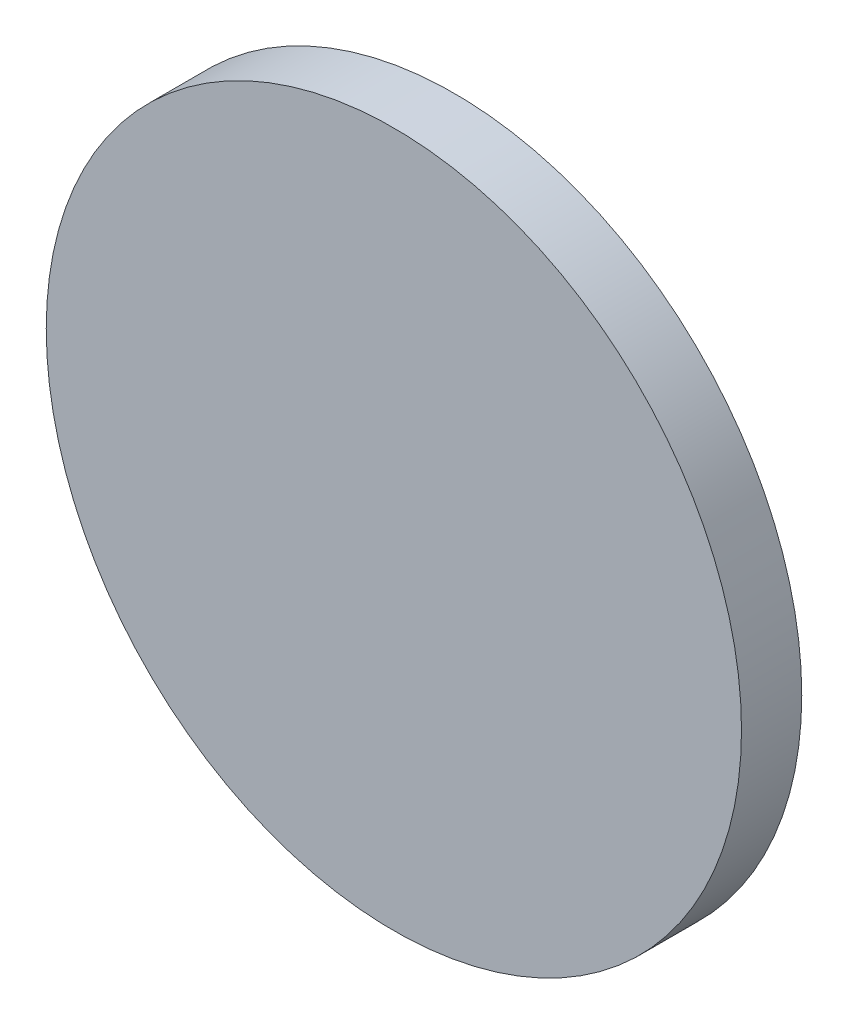
ISO-10303-21;
HEADER;
FILE_DESCRIPTION(('STEP AP214'),'2;1');
FILE_NAME('part.step','',(''),(''),'','','');
FILE_SCHEMA(('AUTOMOTIVE_DESIGN { 1 0 10303 214 1 1 1 1 }'));
ENDSEC;
DATA;
#1=APPLICATION_CONTEXT('core data for automotive mechanical design processes');
#2=APPLICATION_PROTOCOL_DEFINITION('international standard','automotive_design',2000,#1);
#3=PRODUCT_CONTEXT('',#1,'mechanical');
#4=PRODUCT('Part','Part','',(#3));
#5=PRODUCT_RELATED_PRODUCT_CATEGORY('part','',(#4));
#6=PRODUCT_DEFINITION_FORMATION('','',#4);
#7=PRODUCT_DEFINITION_CONTEXT('part definition',#1,'design');
#8=PRODUCT_DEFINITION('design','',#6,#7);
#9=PRODUCT_DEFINITION_SHAPE('','',#8);
#10=(LENGTH_UNIT() NAMED_UNIT(*) SI_UNIT(.MILLI.,.METRE.));
#11=(NAMED_UNIT(*) PLANE_ANGLE_UNIT() SI_UNIT($,.RADIAN.));
#12=(NAMED_UNIT(*) SI_UNIT($,.STERADIAN.) SOLID_ANGLE_UNIT());
#13=UNCERTAINTY_MEASURE_WITH_UNIT(LENGTH_MEASURE(1.E-05),#10,'distance_accuracy_value','');
#14=(GEOMETRIC_REPRESENTATION_CONTEXT(3) GLOBAL_UNCERTAINTY_ASSIGNED_CONTEXT((#13)) GLOBAL_UNIT_ASSIGNED_CONTEXT((#10,
#11,#12)) REPRESENTATION_CONTEXT('',''));
#15=CARTESIAN_POINT('',(0.,0.,0.));
#16=DIRECTION('',(0.,0.,1.));
#17=DIRECTION('',(1.,0.,0.));
#18=AXIS2_PLACEMENT_3D('',#15,#16,#17);
#19=CARTESIAN_POINT('',(0.,0.,6.5));
#20=DIRECTION('',(0.,0.,-1.));
#21=DIRECTION('',(-1.,0.,0.));
#22=AXIS2_PLACEMENT_3D('',#19,#20,#21);
#23=CYLINDRICAL_SURFACE('',#22,37.5);
#24=CARTESIAN_POINT('',(0.,0.,6.5));
#25=DIRECTION('',(0.,0.,1.));
#26=DIRECTION('',(1.,0.,0.));
#27=AXIS2_PLACEMENT_3D('',#24,#25,#26);
#28=CIRCLE('',#27,37.5);
#29=CARTESIAN_POINT('',(-37.5,0.,6.5));
#30=VERTEX_POINT('',#29);
#31=EDGE_CURVE('E10',#30,#30,#28,.T.);
#32=CARTESIAN_POINT('',(0.,0.,0.));
#33=DIRECTION('',(0.,0.,1.));
#34=DIRECTION('',(1.,0.,0.));
#35=AXIS2_PLACEMENT_3D('',#32,#33,#34);
#36=CIRCLE('',#35,37.5);
#37=CARTESIAN_POINT('',(-37.5,0.,0.));
#38=VERTEX_POINT('',#37);
#39=EDGE_CURVE('E37',#38,#38,#36,.T.);
#40=CARTESIAN_POINT('',(-37.5,0.,6.5));
#41=CARTESIAN_POINT('',(-37.5,0.,6.43229166666667));
#42=CARTESIAN_POINT('',(-37.5,0.,6.36458333333333));
#43=CARTESIAN_POINT('',(-37.5,0.,6.22916666666667));
#44=CARTESIAN_POINT('',(-37.5,0.,6.16145833333333));
#45=CARTESIAN_POINT('',(-37.5,0.,6.02604166666667));
#46=CARTESIAN_POINT('',(-37.5,0.,5.95833333333333));
#47=CARTESIAN_POINT('',(-37.5,0.,5.82291666666667));
#48=CARTESIAN_POINT('',(-37.5,0.,5.75520833333333));
#49=CARTESIAN_POINT('',(-37.5,0.,5.61979166666667));
#50=CARTESIAN_POINT('',(-37.5,0.,5.55208333333333));
#51=CARTESIAN_POINT('',(-37.5,0.,5.41666666666667));
#52=CARTESIAN_POINT('',(-37.5,0.,5.34895833333333));
#53=CARTESIAN_POINT('',(-37.5,0.,5.21354166666667));
#54=CARTESIAN_POINT('',(-37.5,0.,5.14583333333333));
#55=CARTESIAN_POINT('',(-37.5,0.,5.01041666666667));
#56=CARTESIAN_POINT('',(-37.5,0.,4.94270833333333));
#57=CARTESIAN_POINT('',(-37.5,0.,4.80729166666667));
#58=CARTESIAN_POINT('',(-37.5,0.,4.73958333333333));
#59=CARTESIAN_POINT('',(-37.5,0.,4.60416666666667));
#60=CARTESIAN_POINT('',(-37.5,0.,4.53645833333333));
#61=CARTESIAN_POINT('',(-37.5,0.,4.40104166666667));
#62=CARTESIAN_POINT('',(-37.5,0.,4.33333333333333));
#63=CARTESIAN_POINT('',(-37.5,0.,4.19791666666667));
#64=CARTESIAN_POINT('',(-37.5,0.,4.13020833333333));
#65=CARTESIAN_POINT('',(-37.5,0.,3.99479166666667));
#66=CARTESIAN_POINT('',(-37.5,0.,3.92708333333333));
#67=CARTESIAN_POINT('',(-37.5,0.,3.79166666666667));
#68=CARTESIAN_POINT('',(-37.5,0.,3.72395833333333));
#69=CARTESIAN_POINT('',(-37.5,0.,3.58854166666667));
#70=CARTESIAN_POINT('',(-37.5,0.,3.52083333333333));
#71=CARTESIAN_POINT('',(-37.5,0.,3.38541666666667));
#72=CARTESIAN_POINT('',(-37.5,0.,3.31770833333333));
#73=CARTESIAN_POINT('',(-37.5,0.,3.18229166666667));
#74=CARTESIAN_POINT('',(-37.5,0.,3.11458333333333));
#75=CARTESIAN_POINT('',(-37.5,0.,2.97916666666667));
#76=CARTESIAN_POINT('',(-37.5,0.,2.91145833333333));
#77=CARTESIAN_POINT('',(-37.5,0.,2.77604166666667));
#78=CARTESIAN_POINT('',(-37.5,0.,2.70833333333333));
#79=CARTESIAN_POINT('',(-37.5,0.,2.57291666666667));
#80=CARTESIAN_POINT('',(-37.5,0.,2.50520833333333));
#81=CARTESIAN_POINT('',(-37.5,0.,2.36979166666667));
#82=CARTESIAN_POINT('',(-37.5,0.,2.30208333333333));
#83=CARTESIAN_POINT('',(-37.5,0.,2.16666666666667));
#84=CARTESIAN_POINT('',(-37.5,0.,2.09895833333333));
#85=CARTESIAN_POINT('',(-37.5,0.,1.96354166666667));
#86=CARTESIAN_POINT('',(-37.5,0.,1.89583333333333));
#87=CARTESIAN_POINT('',(-37.5,0.,1.76041666666667));
#88=CARTESIAN_POINT('',(-37.5,0.,1.69270833333333));
#89=CARTESIAN_POINT('',(-37.5,0.,1.55729166666667));
#90=CARTESIAN_POINT('',(-37.5,0.,1.48958333333333));
#91=CARTESIAN_POINT('',(-37.5,0.,1.35416666666667));
#92=CARTESIAN_POINT('',(-37.5,0.,1.28645833333333));
#93=CARTESIAN_POINT('',(-37.5,0.,1.15104166666667));
#94=CARTESIAN_POINT('',(-37.5,0.,1.08333333333333));
#95=CARTESIAN_POINT('',(-37.5,0.,0.947916666666667));
#96=CARTESIAN_POINT('',(-37.5,0.,0.880208333333333));
#97=CARTESIAN_POINT('',(-37.5,0.,0.744791666666667));
#98=CARTESIAN_POINT('',(-37.5,0.,0.677083333333333));
#99=CARTESIAN_POINT('',(-37.5,0.,0.541666666666667));
#100=CARTESIAN_POINT('',(-37.5,0.,0.473958333333333));
#101=CARTESIAN_POINT('',(-37.5,0.,0.338541666666667));
#102=CARTESIAN_POINT('',(-37.5,0.,0.270833333333334));
#103=CARTESIAN_POINT('',(-37.5,0.,0.135416666666667));
#104=CARTESIAN_POINT('',(-37.5,0.,0.0677083333333334));
#105=CARTESIAN_POINT('',(-37.5,0.,0.));
#106=B_SPLINE_CURVE_WITH_KNOTS('',3,(#40,#41,#42,#43,#44,#45,#46,#47,#48,#49,#50,#51,#52,#53,
#54,#55,#56,#57,#58,#59,#60,#61,#62,#63,#64,#65,#66,#67,#68,#69,#70,#71,#72,#73,#74,#75,#76,#77,
#78,#79,#80,#81,#82,#83,#84,#85,#86,#87,#88,#89,#90,#91,#92,#93,#94,#95,#96,#97,#98,#99,#100,
#101,#102,#103,#104,#105),.UNSPECIFIED.,.F.,.F.,(4,2,2,2,2,2,2,2,2,2,2,2,2,2,2,2,2,2,2,2,2,2,2,
2,2,2,2,2,2,2,2,2,4),(0.,0.203125,0.40625,0.609375000000001,0.812500000000001,1.015625,1.21875,
1.421875,1.625,1.828125,2.03125,2.234375,2.4375,2.640625,2.84375,3.046875,3.25,3.453125,3.65625,
3.859375,4.0625,4.265625,4.46875,4.671875,4.875,5.078125,5.28125,5.484375,5.6875,5.890625,
6.09375,6.296875,6.5),.UNSPECIFIED.);
#107=EDGE_CURVE('BSEAM34',#30,#38,#106,.T.);
#108=ORIENTED_EDGE('',*,*,#31,.F.);
#109=ORIENTED_EDGE('',*,*,#39,.T.);
#110=ORIENTED_EDGE('',*,*,#107,.T.);
#111=ORIENTED_EDGE('',*,*,#107,.F.);
#112=EDGE_LOOP('',(#108,#110,#109,#111));
#113=FACE_BOUND('',#112,.T.);
#114=ADVANCED_FACE('F34',(#113),#23,.T.);
#115=CARTESIAN_POINT('',(0.,0.,6.5));
#116=DIRECTION('',(0.,0.,1.));
#117=DIRECTION('',(1.,0.,0.));
#118=AXIS2_PLACEMENT_3D('',#115,#116,#117);
#119=PLANE('',#118);
#120=ORIENTED_EDGE('',*,*,#31,.T.);
#121=EDGE_LOOP('',(#120));
#122=FACE_BOUND('',#121,.T.);
#123=ADVANCED_FACE('F49',(#122),#119,.T.);
#124=CARTESIAN_POINT('',(0.,0.,0.));
#125=DIRECTION('',(0.,0.,1.));
#126=DIRECTION('',(1.,0.,0.));
#127=AXIS2_PLACEMENT_3D('',#124,#125,#126);
#128=PLANE('',#127);
#129=ORIENTED_EDGE('',*,*,#39,.F.);
#130=EDGE_LOOP('',(#129));
#131=FACE_BOUND('',#130,.T.);
#132=ADVANCED_FACE('F47',(#131),#128,.F.);
#133=CLOSED_SHELL('',(#114,#123,#132));
#134=MANIFOLD_SOLID_BREP('B2',#133);
#135=ADVANCED_BREP_SHAPE_REPRESENTATION('',(#18,#134),#14);
#136=SHAPE_DEFINITION_REPRESENTATION(#9,#135);
ENDSEC;
END-ISO-10303-21;
